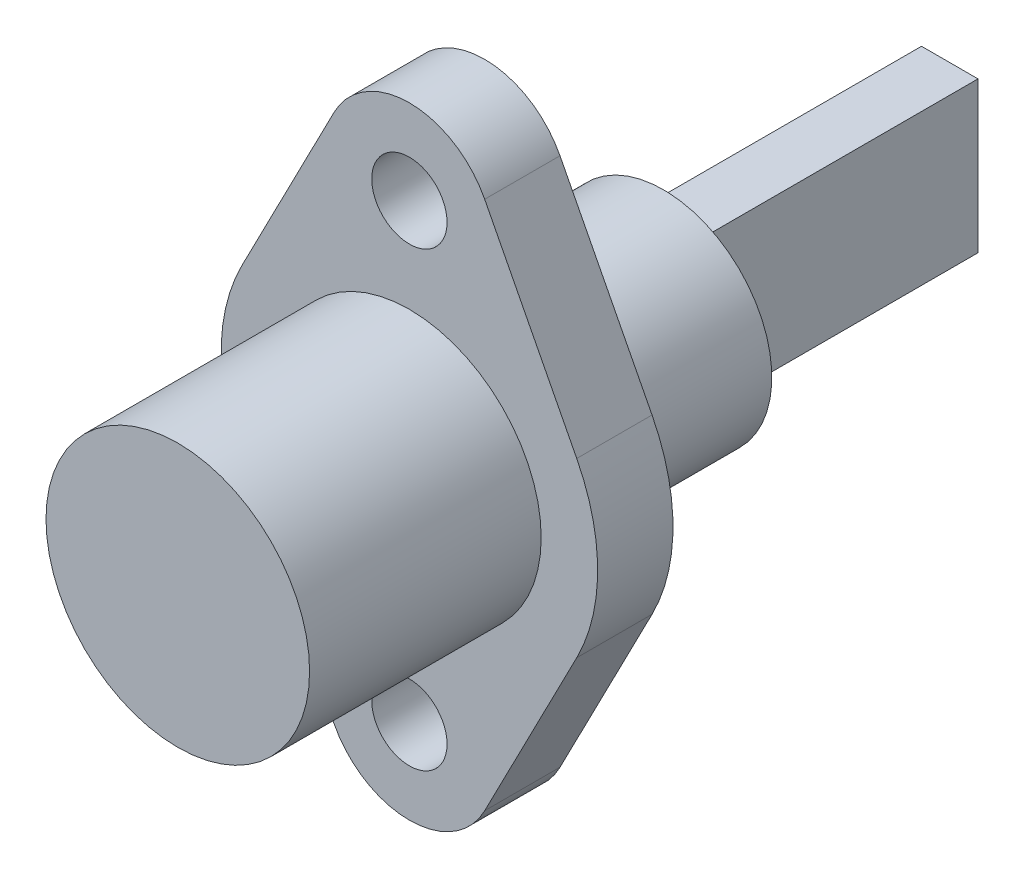
ISO-10303-21;
HEADER;
FILE_DESCRIPTION(('STEP AP214'),'2;1');
FILE_NAME('part.step','',(''),(''),'','','');
FILE_SCHEMA(('AUTOMOTIVE_DESIGN { 1 0 10303 214 1 1 1 1 }'));
ENDSEC;
DATA;
#1=APPLICATION_CONTEXT('core data for automotive mechanical design processes');
#2=APPLICATION_PROTOCOL_DEFINITION('international standard','automotive_design',2000,#1);
#3=PRODUCT_CONTEXT('',#1,'mechanical');
#4=PRODUCT('Part','Part','',(#3));
#5=PRODUCT_RELATED_PRODUCT_CATEGORY('part','',(#4));
#6=PRODUCT_DEFINITION_FORMATION('','',#4);
#7=PRODUCT_DEFINITION_CONTEXT('part definition',#1,'design');
#8=PRODUCT_DEFINITION('design','',#6,#7);
#9=PRODUCT_DEFINITION_SHAPE('','',#8);
#10=(LENGTH_UNIT() NAMED_UNIT(*) SI_UNIT(.MILLI.,.METRE.));
#11=(NAMED_UNIT(*) PLANE_ANGLE_UNIT() SI_UNIT($,.RADIAN.));
#12=(NAMED_UNIT(*) SI_UNIT($,.STERADIAN.) SOLID_ANGLE_UNIT());
#13=UNCERTAINTY_MEASURE_WITH_UNIT(LENGTH_MEASURE(1.E-05),#10,'distance_accuracy_value','');
#14=(GEOMETRIC_REPRESENTATION_CONTEXT(3) GLOBAL_UNCERTAINTY_ASSIGNED_CONTEXT((#13)) GLOBAL_UNIT_ASSIGNED_CONTEXT((#10,
#11,#12)) REPRESENTATION_CONTEXT('',''));
#15=CARTESIAN_POINT('',(0.,0.,0.));
#16=DIRECTION('',(0.,0.,1.));
#17=DIRECTION('',(1.,0.,0.));
#18=AXIS2_PLACEMENT_3D('',#15,#16,#17);
#19=CARTESIAN_POINT('',(-8.88780375320897,4.58333333333333,4.));
#20=DIRECTION('',(0.888780375320898,-0.458333333333334,0.));
#21=DIRECTION('',(0.458333333333334,0.888780375320898,0.));
#22=AXIS2_PLACEMENT_3D('',#19,#20,#21);
#23=PLANE('',#22);
#24=DIRECTION('',(-0.458333333333334,-0.888780375320897,0.));
#25=VECTOR('',#24,1.);
#26=CARTESIAN_POINT('',(-8.88780375320897,4.58333333333333,0.));
#27=LINE('',#26,#25);
#28=CARTESIAN_POINT('',(-3.99951168894404,14.0625,0.));
#29=VERTEX_POINT('',#28);
#30=CARTESIAN_POINT('',(-8.88780375320897,4.58333333333334,0.));
#31=VERTEX_POINT('',#30);
#32=EDGE_CURVE('E160',#29,#31,#27,.T.);
#33=ORIENTED_EDGE('',*,*,#32,.T.);
#34=DIRECTION('',(0.,0.,-1.));
#35=VECTOR('',#34,1.);
#36=CARTESIAN_POINT('',(-8.88780375320897,4.58333333333334,4.));
#37=LINE('',#36,#35);
#38=CARTESIAN_POINT('',(-8.88780375320897,4.58333333333334,4.));
#39=VERTEX_POINT('',#38);
#40=EDGE_CURVE('E191',#39,#31,#37,.T.);
#41=ORIENTED_EDGE('',*,*,#40,.F.);
#42=DIRECTION('',(-0.458333333333334,-0.888780375320897,0.));
#43=VECTOR('',#42,1.);
#44=CARTESIAN_POINT('',(-8.88780375320897,4.58333333333333,4.));
#45=LINE('',#44,#43);
#46=CARTESIAN_POINT('',(-3.99951168894404,14.0625,4.));
#47=VERTEX_POINT('',#46);
#48=EDGE_CURVE('E549',#47,#39,#45,.T.);
#49=ORIENTED_EDGE('',*,*,#48,.F.);
#50=DIRECTION('',(0.,0.,-1.));
#51=VECTOR('',#50,1.);
#52=CARTESIAN_POINT('',(-3.99951168894404,14.0625,4.));
#53=LINE('',#52,#51);
#54=EDGE_CURVE('E156',#47,#29,#53,.T.);
#55=ORIENTED_EDGE('',*,*,#54,.T.);
#56=EDGE_LOOP('',(#33,#41,#49,#55));
#57=FACE_BOUND('',#56,.T.);
#58=ADVANCED_FACE('F43',(#57),#23,.F.);
#59=CARTESIAN_POINT('',(0.,0.,4.));
#60=DIRECTION('',(0.,0.,-1.));
#61=DIRECTION('',(-1.,0.,0.));
#62=AXIS2_PLACEMENT_3D('',#59,#60,#61);
#63=CYLINDRICAL_SURFACE('',#62,10.);
#64=CARTESIAN_POINT('',(0.,0.,0.));
#65=DIRECTION('',(0.,0.,1.));
#66=DIRECTION('',(1.,0.,0.));
#67=AXIS2_PLACEMENT_3D('',#64,#65,#66);
#68=CIRCLE('',#67,10.);
#69=CARTESIAN_POINT('',(-8.88780375320897,-4.58333333333335,0.));
#70=VERTEX_POINT('',#69);
#71=EDGE_CURVE('E164',#31,#70,#68,.T.);
#72=ORIENTED_EDGE('',*,*,#71,.T.);
#73=DIRECTION('',(0.,0.,-1.));
#74=VECTOR('',#73,1.);
#75=CARTESIAN_POINT('',(-8.88780375320897,-4.58333333333335,4.));
#76=LINE('',#75,#74);
#77=CARTESIAN_POINT('',(-8.88780375320897,-4.58333333333335,4.));
#78=VERTEX_POINT('',#77);
#79=EDGE_CURVE('E189',#78,#70,#76,.T.);
#80=ORIENTED_EDGE('',*,*,#79,.F.);
#81=CARTESIAN_POINT('',(0.,0.,4.));
#82=DIRECTION('',(0.,0.,1.));
#83=DIRECTION('',(1.,0.,0.));
#84=AXIS2_PLACEMENT_3D('',#81,#82,#83);
#85=CIRCLE('',#84,10.);
#86=EDGE_CURVE('E108',#39,#78,#85,.T.);
#87=ORIENTED_EDGE('',*,*,#86,.F.);
#88=ORIENTED_EDGE('',*,*,#40,.T.);
#89=EDGE_LOOP('',(#72,#80,#87,#88));
#90=FACE_BOUND('',#89,.T.);
#91=ADVANCED_FACE('F222',(#90),#63,.T.);
#92=CARTESIAN_POINT('',(-8.88780375320897,-4.58333333333334,4.));
#93=DIRECTION('',(-0.888780375320897,-0.458333333333334,0.));
#94=DIRECTION('',(0.458333333333334,-0.888780375320897,0.));
#95=AXIS2_PLACEMENT_3D('',#92,#93,#94);
#96=PLANE('',#95);
#97=DIRECTION('',(-0.458333333333334,0.888780375320897,0.));
#98=VECTOR('',#97,1.);
#99=CARTESIAN_POINT('',(-8.88780375320897,-4.58333333333334,0.));
#100=LINE('',#99,#98);
#101=CARTESIAN_POINT('',(-3.99951168894403,-14.0625,0.));
#102=VERTEX_POINT('',#101);
#103=EDGE_CURVE('E167',#102,#70,#100,.T.);
#104=ORIENTED_EDGE('',*,*,#103,.F.);
#105=DIRECTION('',(0.,0.,-1.));
#106=VECTOR('',#105,1.);
#107=CARTESIAN_POINT('',(-3.99951168894403,-14.0625,4.));
#108=LINE('',#107,#106);
#109=CARTESIAN_POINT('',(-3.99951168894403,-14.0625,4.));
#110=VERTEX_POINT('',#109);
#111=EDGE_CURVE('E187',#110,#102,#108,.T.);
#112=ORIENTED_EDGE('',*,*,#111,.F.);
#113=DIRECTION('',(-0.458333333333334,0.888780375320897,0.));
#114=VECTOR('',#113,1.);
#115=CARTESIAN_POINT('',(-8.88780375320897,-4.58333333333334,4.));
#116=LINE('',#115,#114);
#117=EDGE_CURVE('E551',#110,#78,#116,.T.);
#118=ORIENTED_EDGE('',*,*,#117,.T.);
#119=ORIENTED_EDGE('',*,*,#79,.T.);
#120=EDGE_LOOP('',(#104,#112,#118,#119));
#121=FACE_BOUND('',#120,.T.);
#122=ADVANCED_FACE('F227',(#121),#96,.T.);
#123=CARTESIAN_POINT('',(0.,-12.,4.));
#124=DIRECTION('',(0.,0.,-1.));
#125=DIRECTION('',(-1.,0.,0.));
#126=AXIS2_PLACEMENT_3D('',#123,#124,#125);
#127=CYLINDRICAL_SURFACE('',#126,4.5);
#128=CARTESIAN_POINT('',(0.,-12.,0.));
#129=DIRECTION('',(0.,0.,1.));
#130=DIRECTION('',(1.,0.,0.));
#131=AXIS2_PLACEMENT_3D('',#128,#129,#130);
#132=CIRCLE('',#131,4.5);
#133=CARTESIAN_POINT('',(3.99951168894404,-14.0625,0.));
#134=VERTEX_POINT('',#133);
#135=EDGE_CURVE('E170',#134,#102,#132,.F.);
#136=ORIENTED_EDGE('',*,*,#135,.F.);
#137=DIRECTION('',(0.,0.,-1.));
#138=VECTOR('',#137,1.);
#139=CARTESIAN_POINT('',(3.99951168894404,-14.0625,4.));
#140=LINE('',#139,#138);
#141=CARTESIAN_POINT('',(3.99951168894404,-14.0625,4.));
#142=VERTEX_POINT('',#141);
#143=EDGE_CURVE('E185',#142,#134,#140,.T.);
#144=ORIENTED_EDGE('',*,*,#143,.F.);
#145=CARTESIAN_POINT('',(0.,-12.,4.));
#146=DIRECTION('',(0.,0.,1.));
#147=DIRECTION('',(1.,0.,0.));
#148=AXIS2_PLACEMENT_3D('',#145,#146,#147);
#149=CIRCLE('',#148,4.5);
#150=EDGE_CURVE('E553',#142,#110,#149,.F.);
#151=ORIENTED_EDGE('',*,*,#150,.T.);
#152=ORIENTED_EDGE('',*,*,#111,.T.);
#153=EDGE_LOOP('',(#136,#144,#151,#152));
#154=FACE_BOUND('',#153,.T.);
#155=ADVANCED_FACE('F232',(#154),#127,.T.);
#156=CARTESIAN_POINT('',(8.88780375320898,-4.58333333333334,4.));
#157=DIRECTION('',(-0.888780375320897,0.458333333333334,0.));
#158=DIRECTION('',(-0.458333333333334,-0.888780375320897,0.));
#159=AXIS2_PLACEMENT_3D('',#156,#157,#158);
#160=PLANE('',#159);
#161=DIRECTION('',(0.458333333333334,0.888780375320897,0.));
#162=VECTOR('',#161,1.);
#163=CARTESIAN_POINT('',(8.88780375320898,-4.58333333333334,0.));
#164=LINE('',#163,#162);
#165=CARTESIAN_POINT('',(8.88780375320897,-4.58333333333335,0.));
#166=VERTEX_POINT('',#165);
#167=EDGE_CURVE('E173',#134,#166,#164,.T.);
#168=ORIENTED_EDGE('',*,*,#167,.T.);
#169=DIRECTION('',(0.,0.,-1.));
#170=VECTOR('',#169,1.);
#171=CARTESIAN_POINT('',(8.88780375320897,-4.58333333333335,4.));
#172=LINE('',#171,#170);
#173=CARTESIAN_POINT('',(8.88780375320897,-4.58333333333335,4.));
#174=VERTEX_POINT('',#173);
#175=EDGE_CURVE('E144',#174,#166,#172,.T.);
#176=ORIENTED_EDGE('',*,*,#175,.F.);
#177=DIRECTION('',(0.458333333333334,0.888780375320897,0.));
#178=VECTOR('',#177,1.);
#179=CARTESIAN_POINT('',(8.88780375320898,-4.58333333333334,4.));
#180=LINE('',#179,#178);
#181=EDGE_CURVE('E131',#142,#174,#180,.T.);
#182=ORIENTED_EDGE('',*,*,#181,.F.);
#183=ORIENTED_EDGE('',*,*,#143,.T.);
#184=EDGE_LOOP('',(#168,#176,#182,#183));
#185=FACE_BOUND('',#184,.T.);
#186=ADVANCED_FACE('F236',(#185),#160,.F.);
#187=CARTESIAN_POINT('',(8.88780375320897,4.58333333333334,0.));
#188=VERTEX_POINT('',#187);
#189=EDGE_CURVE('E140',#166,#188,#68,.T.);
#190=ORIENTED_EDGE('',*,*,#189,.T.);
#191=DIRECTION('',(0.,0.,-1.));
#192=VECTOR('',#191,1.);
#193=CARTESIAN_POINT('',(8.88780375320897,4.58333333333334,4.));
#194=LINE('',#193,#192);
#195=CARTESIAN_POINT('',(8.88780375320897,4.58333333333334,4.));
#196=VERTEX_POINT('',#195);
#197=EDGE_CURVE('E137',#196,#188,#194,.T.);
#198=ORIENTED_EDGE('',*,*,#197,.F.);
#199=EDGE_CURVE('E123',#174,#196,#85,.T.);
#200=ORIENTED_EDGE('',*,*,#199,.F.);
#201=ORIENTED_EDGE('',*,*,#175,.T.);
#202=EDGE_LOOP('',(#190,#198,#200,#201));
#203=FACE_BOUND('',#202,.T.);
#204=ADVANCED_FACE('F138',(#203),#63,.T.);
#205=CARTESIAN_POINT('',(8.88780375320897,4.58333333333334,4.));
#206=DIRECTION('',(0.888780375320897,0.458333333333334,0.));
#207=DIRECTION('',(-0.458333333333334,0.888780375320897,0.));
#208=AXIS2_PLACEMENT_3D('',#205,#206,#207);
#209=PLANE('',#208);
#210=DIRECTION('',(0.458333333333334,-0.888780375320897,0.));
#211=VECTOR('',#210,1.);
#212=CARTESIAN_POINT('',(8.88780375320897,4.58333333333334,0.));
#213=LINE('',#212,#211);
#214=CARTESIAN_POINT('',(3.99951168894404,14.0625,0.));
#215=VERTEX_POINT('',#214);
#216=EDGE_CURVE('E175',#215,#188,#213,.T.);
#217=ORIENTED_EDGE('',*,*,#216,.F.);
#218=DIRECTION('',(0.,0.,-1.));
#219=VECTOR('',#218,1.);
#220=CARTESIAN_POINT('',(3.99951168894404,14.0625,4.));
#221=LINE('',#220,#219);
#222=CARTESIAN_POINT('',(3.99951168894404,14.0625,4.));
#223=VERTEX_POINT('',#222);
#224=EDGE_CURVE('E145',#223,#215,#221,.T.);
#225=ORIENTED_EDGE('',*,*,#224,.F.);
#226=DIRECTION('',(0.458333333333334,-0.888780375320897,0.));
#227=VECTOR('',#226,1.);
#228=CARTESIAN_POINT('',(8.88780375320897,4.58333333333334,4.));
#229=LINE('',#228,#227);
#230=EDGE_CURVE('E128',#223,#196,#229,.T.);
#231=ORIENTED_EDGE('',*,*,#230,.T.);
#232=ORIENTED_EDGE('',*,*,#197,.T.);
#233=EDGE_LOOP('',(#217,#225,#231,#232));
#234=FACE_BOUND('',#233,.T.);
#235=ADVANCED_FACE('F147',(#234),#209,.T.);
#236=CARTESIAN_POINT('',(0.,12.,4.));
#237=DIRECTION('',(0.,0.,-1.));
#238=DIRECTION('',(-1.,0.,0.));
#239=AXIS2_PLACEMENT_3D('',#236,#237,#238);
#240=CYLINDRICAL_SURFACE('',#239,4.5);
#241=CARTESIAN_POINT('',(0.,12.,0.));
#242=DIRECTION('',(0.,0.,1.));
#243=DIRECTION('',(1.,0.,0.));
#244=AXIS2_PLACEMENT_3D('',#241,#242,#243);
#245=CIRCLE('',#244,4.5);
#246=EDGE_CURVE('E99',#215,#29,#245,.T.);
#247=ORIENTED_EDGE('',*,*,#246,.T.);
#248=ORIENTED_EDGE('',*,*,#54,.F.);
#249=CARTESIAN_POINT('',(0.,12.,4.));
#250=DIRECTION('',(0.,0.,1.));
#251=DIRECTION('',(1.,0.,0.));
#252=AXIS2_PLACEMENT_3D('',#249,#250,#251);
#253=CIRCLE('',#252,4.5);
#254=EDGE_CURVE('E66',#223,#47,#253,.T.);
#255=ORIENTED_EDGE('',*,*,#254,.F.);
#256=ORIENTED_EDGE('',*,*,#224,.T.);
#257=EDGE_LOOP('',(#247,#248,#255,#256));
#258=FACE_BOUND('',#257,.T.);
#259=ADVANCED_FACE('F218',(#258),#240,.T.);
#260=CARTESIAN_POINT('',(0.,-12.,4.));
#261=DIRECTION('',(0.,0.,-1.));
#262=DIRECTION('',(-1.,0.,0.));
#263=AXIS2_PLACEMENT_3D('',#260,#261,#262);
#264=CYLINDRICAL_SURFACE('',#263,2.);
#265=CARTESIAN_POINT('',(0.,-12.,4.));
#266=DIRECTION('',(0.,0.,1.));
#267=DIRECTION('',(1.,0.,0.));
#268=AXIS2_PLACEMENT_3D('',#265,#266,#267);
#269=CIRCLE('',#268,2.);
#270=CARTESIAN_POINT('',(2.,-12.,4.));
#271=VERTEX_POINT('',#270);
#272=EDGE_CURVE('E181',#271,#271,#269,.T.);
#273=ORIENTED_EDGE('',*,*,#272,.T.);
#274=EDGE_LOOP('',(#273));
#275=FACE_BOUND('',#274,.T.);
#276=CARTESIAN_POINT('',(0.,-12.,0.));
#277=DIRECTION('',(0.,0.,1.));
#278=DIRECTION('',(1.,0.,0.));
#279=AXIS2_PLACEMENT_3D('',#276,#277,#278);
#280=CIRCLE('',#279,2.);
#281=CARTESIAN_POINT('',(2.,-12.,0.));
#282=VERTEX_POINT('',#281);
#283=EDGE_CURVE('E157',#282,#282,#280,.T.);
#284=ORIENTED_EDGE('',*,*,#283,.F.);
#285=EDGE_LOOP('',(#284));
#286=FACE_BOUND('',#285,.T.);
#287=ADVANCED_FACE('F45',(#275,#286),#264,.F.);
#288=CARTESIAN_POINT('',(0.,12.,4.));
#289=DIRECTION('',(0.,0.,-1.));
#290=DIRECTION('',(-1.,0.,0.));
#291=AXIS2_PLACEMENT_3D('',#288,#289,#290);
#292=CYLINDRICAL_SURFACE('',#291,2.);
#293=CARTESIAN_POINT('',(0.,12.,4.));
#294=DIRECTION('',(0.,0.,1.));
#295=DIRECTION('',(1.,0.,0.));
#296=AXIS2_PLACEMENT_3D('',#293,#294,#295);
#297=CIRCLE('',#296,2.);
#298=CARTESIAN_POINT('',(2.,12.,4.));
#299=VERTEX_POINT('',#298);
#300=EDGE_CURVE('E149',#299,#299,#297,.T.);
#301=ORIENTED_EDGE('',*,*,#300,.T.);
#302=EDGE_LOOP('',(#301));
#303=FACE_BOUND('',#302,.T.);
#304=CARTESIAN_POINT('',(0.,12.,0.));
#305=DIRECTION('',(0.,0.,1.));
#306=DIRECTION('',(1.,0.,0.));
#307=AXIS2_PLACEMENT_3D('',#304,#305,#306);
#308=CIRCLE('',#307,2.);
#309=CARTESIAN_POINT('',(2.,12.,0.));
#310=VERTEX_POINT('',#309);
#311=EDGE_CURVE('E178',#310,#310,#308,.T.);
#312=ORIENTED_EDGE('',*,*,#311,.F.);
#313=EDGE_LOOP('',(#312));
#314=FACE_BOUND('',#313,.T.);
#315=ADVANCED_FACE('F208',(#303,#314),#292,.F.);
#316=CARTESIAN_POINT('',(0.,0.,4.));
#317=DIRECTION('',(0.,0.,1.));
#318=DIRECTION('',(1.,0.,0.));
#319=AXIS2_PLACEMENT_3D('',#316,#317,#318);
#320=PLANE('',#319);
#321=CARTESIAN_POINT('',(0.,0.,4.));
#322=DIRECTION('',(0.,0.,1.));
#323=DIRECTION('',(1.,0.,0.));
#324=AXIS2_PLACEMENT_3D('',#321,#322,#323);
#325=CIRCLE('',#324,7.);
#326=CARTESIAN_POINT('',(7.,0.,4.));
#327=VERTEX_POINT('',#326);
#328=EDGE_CURVE('E542',#327,#327,#325,.T.);
#329=ORIENTED_EDGE('',*,*,#328,.F.);
#330=EDGE_LOOP('',(#329));
#331=FACE_BOUND('',#330,.T.);
#332=ORIENTED_EDGE('',*,*,#272,.F.);
#333=EDGE_LOOP('',(#332));
#334=FACE_BOUND('',#333,.T.);
#335=ORIENTED_EDGE('',*,*,#48,.T.);
#336=ORIENTED_EDGE('',*,*,#86,.T.);
#337=ORIENTED_EDGE('',*,*,#117,.F.);
#338=ORIENTED_EDGE('',*,*,#150,.F.);
#339=ORIENTED_EDGE('',*,*,#181,.T.);
#340=ORIENTED_EDGE('',*,*,#199,.T.);
#341=ORIENTED_EDGE('',*,*,#230,.F.);
#342=ORIENTED_EDGE('',*,*,#254,.T.);
#343=EDGE_LOOP('',(#335,#336,#337,#338,#339,#340,#341,#342));
#344=FACE_BOUND('',#343,.T.);
#345=ORIENTED_EDGE('',*,*,#300,.F.);
#346=EDGE_LOOP('',(#345));
#347=FACE_BOUND('',#346,.T.);
#348=ADVANCED_FACE('F125',(#331,#334,#344,#347),#320,.T.);
#349=CARTESIAN_POINT('',(0.,0.,0.));
#350=DIRECTION('',(0.,0.,1.));
#351=DIRECTION('',(1.,0.,0.));
#352=AXIS2_PLACEMENT_3D('',#349,#350,#351);
#353=PLANE('',#352);
#354=CARTESIAN_POINT('',(0.,0.,0.));
#355=DIRECTION('',(0.,0.,1.));
#356=DIRECTION('',(1.,0.,0.));
#357=AXIS2_PLACEMENT_3D('',#354,#355,#356);
#358=CIRCLE('',#357,7.5);
#359=CARTESIAN_POINT('',(7.5,0.,0.));
#360=VERTEX_POINT('',#359);
#361=EDGE_CURVE('E51',#360,#360,#358,.F.);
#362=ORIENTED_EDGE('',*,*,#361,.F.);
#363=EDGE_LOOP('',(#362));
#364=FACE_BOUND('',#363,.T.);
#365=ORIENTED_EDGE('',*,*,#283,.T.);
#366=EDGE_LOOP('',(#365));
#367=FACE_BOUND('',#366,.T.);
#368=ORIENTED_EDGE('',*,*,#32,.F.);
#369=ORIENTED_EDGE('',*,*,#246,.F.);
#370=ORIENTED_EDGE('',*,*,#216,.T.);
#371=ORIENTED_EDGE('',*,*,#189,.F.);
#372=ORIENTED_EDGE('',*,*,#167,.F.);
#373=ORIENTED_EDGE('',*,*,#135,.T.);
#374=ORIENTED_EDGE('',*,*,#103,.T.);
#375=ORIENTED_EDGE('',*,*,#71,.F.);
#376=EDGE_LOOP('',(#368,#369,#370,#371,#372,#373,#374,#375));
#377=FACE_BOUND('',#376,.T.);
#378=ORIENTED_EDGE('',*,*,#311,.T.);
#379=EDGE_LOOP('',(#378));
#380=FACE_BOUND('',#379,.T.);
#381=ADVANCED_FACE('F197',(#364,#367,#377,#380),#353,.F.);
#382=CARTESIAN_POINT('',(0.,0.,16.3));
#383=DIRECTION('',(0.,0.,-1.));
#384=DIRECTION('',(-1.,0.,0.));
#385=AXIS2_PLACEMENT_3D('',#382,#383,#384);
#386=CYLINDRICAL_SURFACE('',#385,7.);
#387=CARTESIAN_POINT('',(0.,0.,16.3));
#388=DIRECTION('',(0.,0.,1.));
#389=DIRECTION('',(1.,0.,0.));
#390=AXIS2_PLACEMENT_3D('',#387,#388,#389);
#391=CIRCLE('',#390,7.);
#392=CARTESIAN_POINT('',(7.,0.,16.3));
#393=VERTEX_POINT('',#392);
#394=EDGE_CURVE('E161',#393,#393,#391,.T.);
#395=ORIENTED_EDGE('',*,*,#394,.F.);
#396=EDGE_LOOP('',(#395));
#397=FACE_BOUND('',#396,.T.);
#398=ORIENTED_EDGE('',*,*,#328,.T.);
#399=EDGE_LOOP('',(#398));
#400=FACE_BOUND('',#399,.T.);
#401=ADVANCED_FACE('F200',(#397,#400),#386,.T.);
#402=CARTESIAN_POINT('',(0.,0.,16.3));
#403=DIRECTION('',(0.,0.,1.));
#404=DIRECTION('',(1.,0.,0.));
#405=AXIS2_PLACEMENT_3D('',#402,#403,#404);
#406=PLANE('',#405);
#407=ORIENTED_EDGE('',*,*,#394,.T.);
#408=EDGE_LOOP('',(#407));
#409=FACE_BOUND('',#408,.T.);
#410=ADVANCED_FACE('F276',(#409),#406,.T.);
#411=CARTESIAN_POINT('',(0.,0.,-0.5));
#412=DIRECTION('',(0.,0.,1.));
#413=DIRECTION('',(1.,0.,0.));
#414=AXIS2_PLACEMENT_3D('',#411,#412,#413);
#415=CYLINDRICAL_SURFACE('',#414,7.5);
#416=CARTESIAN_POINT('',(0.,0.,-0.5));
#417=DIRECTION('',(0.,0.,-1.));
#418=DIRECTION('',(-1.,0.,0.));
#419=AXIS2_PLACEMENT_3D('',#416,#417,#418);
#420=CIRCLE('',#419,7.5);
#421=CARTESIAN_POINT('',(-7.5,0.,-0.5));
#422=VERTEX_POINT('',#421);
#423=EDGE_CURVE('E539',#422,#422,#420,.T.);
#424=ORIENTED_EDGE('',*,*,#423,.F.);
#425=EDGE_LOOP('',(#424));
#426=FACE_BOUND('',#425,.T.);
#427=ORIENTED_EDGE('',*,*,#361,.T.);
#428=EDGE_LOOP('',(#427));
#429=FACE_BOUND('',#428,.T.);
#430=ADVANCED_FACE('F195',(#426,#429),#415,.T.);
#431=CARTESIAN_POINT('',(0.,0.,-0.5));
#432=DIRECTION('',(0.,0.,-1.));
#433=DIRECTION('',(-1.,0.,0.));
#434=AXIS2_PLACEMENT_3D('',#431,#432,#433);
#435=PLANE('',#434);
#436=CARTESIAN_POINT('',(0.,0.,-0.5));
#437=DIRECTION('',(0.,0.,-1.));
#438=DIRECTION('',(-1.,0.,0.));
#439=AXIS2_PLACEMENT_3D('',#436,#437,#438);
#440=CIRCLE('',#439,5.75);
#441=CARTESIAN_POINT('',(-5.75,0.,-0.5));
#442=VERTEX_POINT('',#441);
#443=EDGE_CURVE('E595',#442,#442,#440,.T.);
#444=ORIENTED_EDGE('',*,*,#443,.F.);
#445=EDGE_LOOP('',(#444));
#446=FACE_BOUND('',#445,.T.);
#447=ORIENTED_EDGE('',*,*,#423,.T.);
#448=EDGE_LOOP('',(#447));
#449=FACE_BOUND('',#448,.T.);
#450=ADVANCED_FACE('F304',(#446,#449),#435,.T.);
#451=CARTESIAN_POINT('',(0.,0.,-9.5));
#452=DIRECTION('',(0.,0.,-1.));
#453=DIRECTION('',(-1.,0.,0.));
#454=AXIS2_PLACEMENT_3D('',#451,#452,#453);
#455=PLANE('',#454);
#456=CARTESIAN_POINT('',(0.,0.,-9.5));
#457=DIRECTION('',(0.,0.,-1.));
#458=DIRECTION('',(-1.,0.,0.));
#459=AXIS2_PLACEMENT_3D('',#456,#457,#458);
#460=CIRCLE('',#459,5.75);
#461=CARTESIAN_POINT('',(-5.75,0.,-9.5));
#462=VERTEX_POINT('',#461);
#463=EDGE_CURVE('E591',#462,#462,#460,.T.);
#464=ORIENTED_EDGE('',*,*,#463,.T.);
#465=EDGE_LOOP('',(#464));
#466=FACE_BOUND('',#465,.T.);
#467=DIRECTION('',(0.,1.,0.));
#468=VECTOR('',#467,1.);
#469=CARTESIAN_POINT('',(-1.5,4.,-9.5));
#470=LINE('',#469,#468);
#471=CARTESIAN_POINT('',(-1.5,-4.,-9.5));
#472=VERTEX_POINT('',#471);
#473=CARTESIAN_POINT('',(-1.5,4.,-9.5));
#474=VERTEX_POINT('',#473);
#475=EDGE_CURVE('E58',#472,#474,#470,.T.);
#476=ORIENTED_EDGE('',*,*,#475,.F.);
#477=DIRECTION('',(-1.,0.,0.));
#478=VECTOR('',#477,1.);
#479=CARTESIAN_POINT('',(1.5,-4.,-9.5));
#480=LINE('',#479,#478);
#481=CARTESIAN_POINT('',(1.5,-4.,-9.5));
#482=VERTEX_POINT('',#481);
#483=EDGE_CURVE('E11',#482,#472,#480,.T.);
#484=ORIENTED_EDGE('',*,*,#483,.F.);
#485=DIRECTION('',(0.,-1.,0.));
#486=VECTOR('',#485,1.);
#487=CARTESIAN_POINT('',(1.5,4.,-9.5));
#488=LINE('',#487,#486);
#489=CARTESIAN_POINT('',(1.5,4.,-9.5));
#490=VERTEX_POINT('',#489);
#491=EDGE_CURVE('E590',#490,#482,#488,.T.);
#492=ORIENTED_EDGE('',*,*,#491,.F.);
#493=DIRECTION('',(1.,0.,0.));
#494=VECTOR('',#493,1.);
#495=CARTESIAN_POINT('',(1.5,4.,-9.5));
#496=LINE('',#495,#494);
#497=EDGE_CURVE('E573',#474,#490,#496,.T.);
#498=ORIENTED_EDGE('',*,*,#497,.F.);
#499=EDGE_LOOP('',(#476,#484,#492,#498));
#500=FACE_BOUND('',#499,.T.);
#501=ADVANCED_FACE('F332',(#466,#500),#455,.T.);
#502=CARTESIAN_POINT('',(0.,0.,-9.5));
#503=DIRECTION('',(0.,0.,1.));
#504=DIRECTION('',(1.,0.,0.));
#505=AXIS2_PLACEMENT_3D('',#502,#503,#504);
#506=CYLINDRICAL_SURFACE('',#505,5.75);
#507=ORIENTED_EDGE('',*,*,#463,.F.);
#508=EDGE_LOOP('',(#507));
#509=FACE_BOUND('',#508,.T.);
#510=ORIENTED_EDGE('',*,*,#443,.T.);
#511=EDGE_LOOP('',(#510));
#512=FACE_BOUND('',#511,.T.);
#513=ADVANCED_FACE('F319',(#509,#512),#506,.T.);
#514=CARTESIAN_POINT('',(0.,0.,-24.7));
#515=DIRECTION('',(0.,0.,-1.));
#516=DIRECTION('',(-1.,0.,0.));
#517=AXIS2_PLACEMENT_3D('',#514,#515,#516);
#518=PLANE('',#517);
#519=DIRECTION('',(0.,1.,0.));
#520=VECTOR('',#519,1.);
#521=CARTESIAN_POINT('',(-1.5,4.,-24.7));
#522=LINE('',#521,#520);
#523=CARTESIAN_POINT('',(-1.5,-4.,-24.7));
#524=VERTEX_POINT('',#523);
#525=CARTESIAN_POINT('',(-1.5,4.,-24.7));
#526=VERTEX_POINT('',#525);
#527=EDGE_CURVE('E522',#524,#526,#522,.T.);
#528=ORIENTED_EDGE('',*,*,#527,.T.);
#529=DIRECTION('',(1.,0.,0.));
#530=VECTOR('',#529,1.);
#531=CARTESIAN_POINT('',(1.5,4.,-24.7));
#532=LINE('',#531,#530);
#533=CARTESIAN_POINT('',(1.5,4.,-24.7));
#534=VERTEX_POINT('',#533);
#535=EDGE_CURVE('E576',#526,#534,#532,.T.);
#536=ORIENTED_EDGE('',*,*,#535,.T.);
#537=DIRECTION('',(0.,-1.,0.));
#538=VECTOR('',#537,1.);
#539=CARTESIAN_POINT('',(1.5,4.,-24.7));
#540=LINE('',#539,#538);
#541=CARTESIAN_POINT('',(1.5,-4.,-24.7));
#542=VERTEX_POINT('',#541);
#543=EDGE_CURVE('E531',#534,#542,#540,.T.);
#544=ORIENTED_EDGE('',*,*,#543,.T.);
#545=DIRECTION('',(-1.,0.,0.));
#546=VECTOR('',#545,1.);
#547=CARTESIAN_POINT('',(1.5,-4.,-24.7));
#548=LINE('',#547,#546);
#549=EDGE_CURVE('E525',#542,#524,#548,.T.);
#550=ORIENTED_EDGE('',*,*,#549,.T.);
#551=EDGE_LOOP('',(#528,#536,#544,#550));
#552=FACE_BOUND('',#551,.T.);
#553=ADVANCED_FACE('F313',(#552),#518,.T.);
#554=CARTESIAN_POINT('',(1.5,-4.,-24.7));
#555=DIRECTION('',(0.,1.,0.));
#556=DIRECTION('',(0.,0.,1.));
#557=AXIS2_PLACEMENT_3D('',#554,#555,#556);
#558=PLANE('',#557);
#559=DIRECTION('',(0.,0.,1.));
#560=VECTOR('',#559,1.);
#561=CARTESIAN_POINT('',(1.5,-4.,-24.7));
#562=LINE('',#561,#560);
#563=EDGE_CURVE('E524',#542,#482,#562,.T.);
#564=ORIENTED_EDGE('',*,*,#563,.T.);
#565=ORIENTED_EDGE('',*,*,#483,.T.);
#566=DIRECTION('',(0.,0.,1.));
#567=VECTOR('',#566,1.);
#568=CARTESIAN_POINT('',(-1.5,-4.,-24.7));
#569=LINE('',#568,#567);
#570=EDGE_CURVE('E517',#524,#472,#569,.T.);
#571=ORIENTED_EDGE('',*,*,#570,.F.);
#572=ORIENTED_EDGE('',*,*,#549,.F.);
#573=EDGE_LOOP('',(#564,#565,#571,#572));
#574=FACE_BOUND('',#573,.T.);
#575=ADVANCED_FACE('F318',(#574),#558,.F.);
#576=CARTESIAN_POINT('',(1.5,4.,-24.7));
#577=DIRECTION('',(-1.,0.,0.));
#578=DIRECTION('',(0.,-1.,0.));
#579=AXIS2_PLACEMENT_3D('',#576,#577,#578);
#580=PLANE('',#579);
#581=DIRECTION('',(0.,0.,1.));
#582=VECTOR('',#581,1.);
#583=CARTESIAN_POINT('',(1.5,4.,-24.7));
#584=LINE('',#583,#582);
#585=EDGE_CURVE('E528',#534,#490,#584,.T.);
#586=ORIENTED_EDGE('',*,*,#585,.T.);
#587=ORIENTED_EDGE('',*,*,#491,.T.);
#588=ORIENTED_EDGE('',*,*,#563,.F.);
#589=ORIENTED_EDGE('',*,*,#543,.F.);
#590=EDGE_LOOP('',(#586,#587,#588,#589));
#591=FACE_BOUND('',#590,.T.);
#592=ADVANCED_FACE('F360',(#591),#580,.F.);
#593=CARTESIAN_POINT('',(1.5,4.,-24.7));
#594=DIRECTION('',(0.,-1.,0.));
#595=DIRECTION('',(0.,0.,-1.));
#596=AXIS2_PLACEMENT_3D('',#593,#594,#595);
#597=PLANE('',#596);
#598=DIRECTION('',(0.,0.,1.));
#599=VECTOR('',#598,1.);
#600=CARTESIAN_POINT('',(-1.5,4.,-24.7));
#601=LINE('',#600,#599);
#602=EDGE_CURVE('E537',#526,#474,#601,.T.);
#603=ORIENTED_EDGE('',*,*,#602,.T.);
#604=ORIENTED_EDGE('',*,*,#497,.T.);
#605=ORIENTED_EDGE('',*,*,#585,.F.);
#606=ORIENTED_EDGE('',*,*,#535,.F.);
#607=EDGE_LOOP('',(#603,#604,#605,#606));
#608=FACE_BOUND('',#607,.T.);
#609=ADVANCED_FACE('F371',(#608),#597,.F.);
#610=CARTESIAN_POINT('',(-1.5,4.,-24.7));
#611=DIRECTION('',(1.,0.,0.));
#612=DIRECTION('',(0.,1.,0.));
#613=AXIS2_PLACEMENT_3D('',#610,#611,#612);
#614=PLANE('',#613);
#615=ORIENTED_EDGE('',*,*,#570,.T.);
#616=ORIENTED_EDGE('',*,*,#475,.T.);
#617=ORIENTED_EDGE('',*,*,#602,.F.);
#618=ORIENTED_EDGE('',*,*,#527,.F.);
#619=EDGE_LOOP('',(#615,#616,#617,#618));
#620=FACE_BOUND('',#619,.T.);
#621=ADVANCED_FACE('F382',(#620),#614,.F.);
#622=CLOSED_SHELL('',(#58,#91,#122,#155,#186,#204,#235,#259,#287,#315,#348,#381,#401,#410,#430,
#450,#501,#513,#553,#575,#592,#609,#621));
#623=MANIFOLD_SOLID_BREP('B2',#622);
#624=ADVANCED_BREP_SHAPE_REPRESENTATION('',(#18,#623),#14);
#625=SHAPE_DEFINITION_REPRESENTATION(#9,#624);
ENDSEC;
END-ISO-10303-21;
